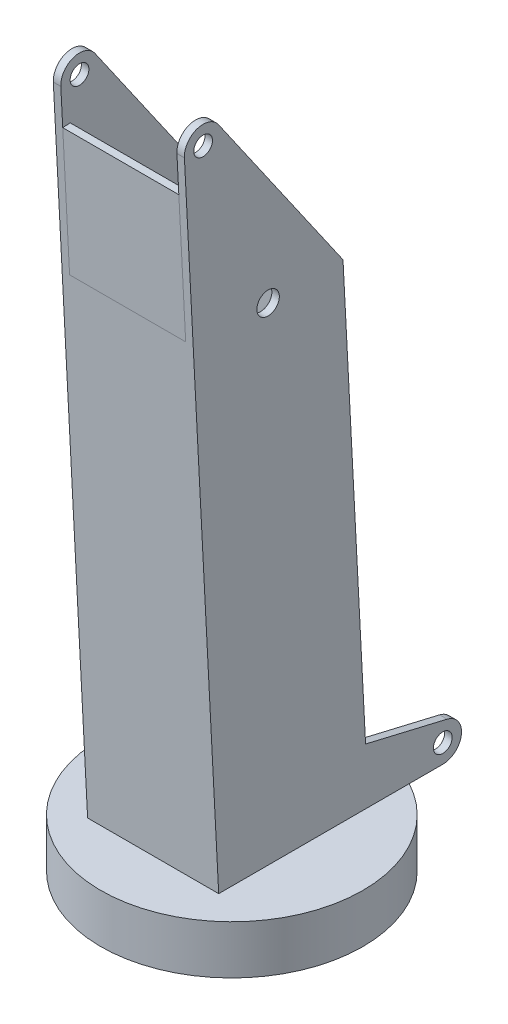
ISO-10303-21;
HEADER;
FILE_DESCRIPTION(('STEP AP214'),'2;1');
FILE_NAME('part.step','',(''),(''),'','','');
FILE_SCHEMA(('AUTOMOTIVE_DESIGN { 1 0 10303 214 1 1 1 1 }'));
ENDSEC;
DATA;
#1=APPLICATION_CONTEXT('core data for automotive mechanical design processes');
#2=APPLICATION_PROTOCOL_DEFINITION('international standard','automotive_design',2000,#1);
#3=PRODUCT_CONTEXT('',#1,'mechanical');
#4=PRODUCT('Part','Part','',(#3));
#5=PRODUCT_RELATED_PRODUCT_CATEGORY('part','',(#4));
#6=PRODUCT_DEFINITION_FORMATION('','',#4);
#7=PRODUCT_DEFINITION_CONTEXT('part definition',#1,'design');
#8=PRODUCT_DEFINITION('design','',#6,#7);
#9=PRODUCT_DEFINITION_SHAPE('','',#8);
#10=(LENGTH_UNIT() NAMED_UNIT(*) SI_UNIT(.MILLI.,.METRE.));
#11=(NAMED_UNIT(*) PLANE_ANGLE_UNIT() SI_UNIT($,.RADIAN.));
#12=(NAMED_UNIT(*) SI_UNIT($,.STERADIAN.) SOLID_ANGLE_UNIT());
#13=UNCERTAINTY_MEASURE_WITH_UNIT(LENGTH_MEASURE(1.E-05),#10,'distance_accuracy_value','');
#14=(GEOMETRIC_REPRESENTATION_CONTEXT(3) GLOBAL_UNCERTAINTY_ASSIGNED_CONTEXT((#13)) GLOBAL_UNIT_ASSIGNED_CONTEXT((#10,
#11,#12)) REPRESENTATION_CONTEXT('',''));
#15=CARTESIAN_POINT('',(0.,0.,0.));
#16=DIRECTION('',(0.,0.,1.));
#17=DIRECTION('',(1.,0.,0.));
#18=AXIS2_PLACEMENT_3D('',#15,#16,#17);
#19=CARTESIAN_POINT('',(-330.,350.56705628896,-1.6550060100623));
#20=DIRECTION('',(0.,0.998629534754574,0.0523359562429405));
#21=DIRECTION('',(0.,-0.0523359562429405,0.998629534754574));
#22=AXIS2_PLACEMENT_3D('',#19,#20,#21);
#23=PLANE('',#22);
#24=DIRECTION('',(-1.,0.,0.));
#25=VECTOR('',#24,1.);
#26=CARTESIAN_POINT('',(-330.,349.520337164101,18.3175846850292));
#27=LINE('',#26,#25);
#28=CARTESIAN_POINT('',(-20.,349.520337164101,18.3175846850292));
#29=VERTEX_POINT('',#28);
#30=CARTESIAN_POINT('',(-330.,349.520337164101,18.3175846850292));
#31=VERTEX_POINT('',#30);
#32=EDGE_CURVE('E108',#29,#31,#27,.T.);
#33=ORIENTED_EDGE('',*,*,#32,.F.);
#34=DIRECTION('',(0.,-0.0523359562429405,0.998629534754574));
#35=VECTOR('',#34,1.);
#36=CARTESIAN_POINT('',(-20.,350.56705628896,-1.6550060100623));
#37=LINE('',#36,#35);
#38=CARTESIAN_POINT('',(-20.,350.56705628896,-1.6550060100623));
#39=VERTEX_POINT('',#38);
#40=EDGE_CURVE('E12',#39,#29,#37,.T.);
#41=ORIENTED_EDGE('',*,*,#40,.F.);
#42=DIRECTION('',(-1.,0.,0.));
#43=VECTOR('',#42,1.);
#44=CARTESIAN_POINT('',(-330.,350.56705628896,-1.6550060100623));
#45=LINE('',#44,#43);
#46=CARTESIAN_POINT('',(-330.,350.56705628896,-1.6550060100623));
#47=VERTEX_POINT('',#46);
#48=EDGE_CURVE('E102',#39,#47,#45,.T.);
#49=ORIENTED_EDGE('',*,*,#48,.T.);
#50=DIRECTION('',(0.,-0.0523359562429405,0.998629534754574));
#51=VECTOR('',#50,1.);
#52=CARTESIAN_POINT('',(-330.,350.56705628896,-1.6550060100623));
#53=LINE('',#52,#51);
#54=EDGE_CURVE('E47',#47,#31,#53,.T.);
#55=ORIENTED_EDGE('',*,*,#54,.T.);
#56=EDGE_LOOP('',(#33,#41,#49,#55));
#57=FACE_BOUND('',#56,.T.);
#58=ADVANCED_FACE('F44',(#57),#23,.T.);
#59=CARTESIAN_POINT('',(-20.,350.56705628896,-1.6550060100623));
#60=DIRECTION('',(1.,0.,0.));
#61=DIRECTION('',(0.,1.,0.));
#62=AXIS2_PLACEMENT_3D('',#59,#60,#61);
#63=PLANE('',#62);
#64=DIRECTION('',(0.,0.998629534754574,0.0523359562429405));
#65=VECTOR('',#64,1.);
#66=CARTESIAN_POINT('',(-20.,349.520337164101,18.3175846850292));
#67=LINE('',#66,#65);
#68=CARTESIAN_POINT('',(-20.,0.,0.));
#69=VERTEX_POINT('',#68);
#70=EDGE_CURVE('E104',#69,#29,#67,.T.);
#71=ORIENTED_EDGE('',*,*,#70,.F.);
#72=DIRECTION('',(0.,-0.0523359562429405,0.998629534754574));
#73=VECTOR('',#72,1.);
#74=CARTESIAN_POINT('',(-20.,1.04671912485881,-19.9725906950915));
#75=LINE('',#74,#73);
#76=CARTESIAN_POINT('',(-20.,1.04671912485881,-19.9725906950915));
#77=VERTEX_POINT('',#76);
#78=EDGE_CURVE('E53',#77,#69,#75,.T.);
#79=ORIENTED_EDGE('',*,*,#78,.F.);
#80=DIRECTION('',(0.,0.998629534754574,0.0523359562429405));
#81=VECTOR('',#80,1.);
#82=CARTESIAN_POINT('',(-20.,350.56705628896,-1.6550060100623));
#83=LINE('',#82,#81);
#84=EDGE_CURVE('E99',#77,#39,#83,.T.);
#85=ORIENTED_EDGE('',*,*,#84,.T.);
#86=ORIENTED_EDGE('',*,*,#40,.T.);
#87=EDGE_LOOP('',(#71,#79,#85,#86));
#88=FACE_BOUND('',#87,.T.);
#89=ADVANCED_FACE('F118',(#88),#63,.T.);
#90=CARTESIAN_POINT('',(-330.,1.04671912485881,-19.9725906950915));
#91=DIRECTION('',(0.,-0.998629534754574,-0.0523359562429405));
#92=DIRECTION('',(0.,0.0523359562429405,-0.998629534754574));
#93=AXIS2_PLACEMENT_3D('',#90,#91,#92);
#94=PLANE('',#93);
#95=DIRECTION('',(1.,0.,0.));
#96=VECTOR('',#95,1.);
#97=CARTESIAN_POINT('',(-330.,0.,0.));
#98=LINE('',#97,#96);
#99=CARTESIAN_POINT('',(-330.,0.,0.));
#100=VERTEX_POINT('',#99);
#101=EDGE_CURVE('E94',#100,#69,#98,.T.);
#102=ORIENTED_EDGE('',*,*,#101,.F.);
#103=DIRECTION('',(0.,-0.0523359562429405,0.998629534754574));
#104=VECTOR('',#103,1.);
#105=CARTESIAN_POINT('',(-330.,1.04671912485881,-19.9725906950915));
#106=LINE('',#105,#104);
#107=CARTESIAN_POINT('',(-330.,1.04671912485881,-19.9725906950915));
#108=VERTEX_POINT('',#107);
#109=EDGE_CURVE('E89',#108,#100,#106,.T.);
#110=ORIENTED_EDGE('',*,*,#109,.F.);
#111=DIRECTION('',(1.,0.,0.));
#112=VECTOR('',#111,1.);
#113=CARTESIAN_POINT('',(-330.,1.04671912485881,-19.9725906950915));
#114=LINE('',#113,#112);
#115=EDGE_CURVE('E92',#108,#77,#114,.T.);
#116=ORIENTED_EDGE('',*,*,#115,.T.);
#117=ORIENTED_EDGE('',*,*,#78,.T.);
#118=EDGE_LOOP('',(#102,#110,#116,#117));
#119=FACE_BOUND('',#118,.T.);
#120=ADVANCED_FACE('F91',(#119),#94,.T.);
#121=CARTESIAN_POINT('',(-330.,350.56705628896,-1.6550060100623));
#122=DIRECTION('',(-1.,0.,0.));
#123=DIRECTION('',(0.,0.,1.));
#124=AXIS2_PLACEMENT_3D('',#121,#122,#123);
#125=PLANE('',#124);
#126=DIRECTION('',(0.,-0.998629534754574,-0.0523359562429405));
#127=VECTOR('',#126,1.);
#128=CARTESIAN_POINT('',(-330.,349.520337164101,18.3175846850292));
#129=LINE('',#128,#127);
#130=EDGE_CURVE('E111',#31,#100,#129,.T.);
#131=ORIENTED_EDGE('',*,*,#130,.F.);
#132=ORIENTED_EDGE('',*,*,#54,.F.);
#133=DIRECTION('',(0.,-0.998629534754574,-0.0523359562429405));
#134=VECTOR('',#133,1.);
#135=CARTESIAN_POINT('',(-330.,350.56705628896,-1.6550060100623));
#136=LINE('',#135,#134);
#137=EDGE_CURVE('E98',#47,#108,#136,.T.);
#138=ORIENTED_EDGE('',*,*,#137,.T.);
#139=ORIENTED_EDGE('',*,*,#109,.T.);
#140=EDGE_LOOP('',(#131,#132,#138,#139));
#141=FACE_BOUND('',#140,.T.);
#142=ADVANCED_FACE('F101',(#141),#125,.T.);
#143=CARTESIAN_POINT('',(0.,1.04671912485881,-19.9725906950915));
#144=DIRECTION('',(0.,0.0523359562429405,-0.998629534754574));
#145=DIRECTION('',(0.,0.998629534754574,0.0523359562429405));
#146=AXIS2_PLACEMENT_3D('',#143,#144,#145);
#147=PLANE('',#146);
#148=ORIENTED_EDGE('',*,*,#48,.F.);
#149=ORIENTED_EDGE('',*,*,#84,.F.);
#150=ORIENTED_EDGE('',*,*,#115,.F.);
#151=ORIENTED_EDGE('',*,*,#137,.F.);
#152=EDGE_LOOP('',(#148,#149,#150,#151));
#153=FACE_BOUND('',#152,.T.);
#154=ADVANCED_FACE('F97',(#153),#147,.T.);
#155=CARTESIAN_POINT('',(0.,0.,0.));
#156=DIRECTION('',(0.,0.0523359562429405,-0.998629534754574));
#157=DIRECTION('',(0.,0.998629534754574,0.0523359562429405));
#158=AXIS2_PLACEMENT_3D('',#155,#156,#157);
#159=PLANE('',#158);
#160=ORIENTED_EDGE('',*,*,#32,.T.);
#161=ORIENTED_EDGE('',*,*,#130,.T.);
#162=ORIENTED_EDGE('',*,*,#101,.T.);
#163=ORIENTED_EDGE('',*,*,#70,.T.);
#164=EDGE_LOOP('',(#160,#161,#162,#163));
#165=FACE_BOUND('',#164,.T.);
#166=ADVANCED_FACE('F117',(#165),#159,.F.);
#167=CLOSED_SHELL('',(#58,#89,#120,#142,#154,#166));
#168=MANIFOLD_SOLID_BREP('B2',#167);
#169=CARTESIAN_POINT('',(-350.,-1300.,-68.1301130679493));
#170=DIRECTION('',(0.,-1.,0.));
#171=DIRECTION('',(0.,0.,-1.));
#172=AXIS2_PLACEMENT_3D('',#169,#170,#171);
#173=PLANE('',#172);
#174=DIRECTION('',(0.,0.,-1.));
#175=VECTOR('',#174,1.);
#176=CARTESIAN_POINT('',(-330.,-1300.,-468.130113067949));
#177=LINE('',#176,#175);
#178=CARTESIAN_POINT('',(-330.,-1300.,-576.796599748962));
#179=VERTEX_POINT('',#178);
#180=CARTESIAN_POINT('',(-330.,-1300.,-666.485116622529));
#181=VERTEX_POINT('',#180);
#182=EDGE_CURVE('E521',#179,#181,#177,.T.);
#183=ORIENTED_EDGE('',*,*,#182,.F.);
#184=CARTESIAN_POINT('',(-165.,-1300.,-268.130113067949));
#185=DIRECTION('',(0.,-1.,0.));
#186=DIRECTION('',(0.,0.,-1.));
#187=AXIS2_PLACEMENT_3D('',#184,#185,#186);
#188=CIRCLE('',#187,350.);
#189=CARTESIAN_POINT('',(-350.,-1300.,-565.241203402861));
#190=VERTEX_POINT('',#189);
#191=EDGE_CURVE('E184',#190,#179,#188,.T.);
#192=ORIENTED_EDGE('',*,*,#191,.F.);
#193=DIRECTION('',(0.,0.,-1.));
#194=VECTOR('',#193,1.);
#195=CARTESIAN_POINT('',(-350.,-1300.,-68.1301130679493));
#196=LINE('',#195,#194);
#197=CARTESIAN_POINT('',(-350.,-1300.,-666.485116622529));
#198=VERTEX_POINT('',#197);
#199=EDGE_CURVE('E441',#190,#198,#196,.T.);
#200=ORIENTED_EDGE('',*,*,#199,.T.);
#201=DIRECTION('',(-1.,0.,0.));
#202=VECTOR('',#201,1.);
#203=CARTESIAN_POINT('',(-330.,-1300.,-666.485116622529));
#204=LINE('',#203,#202);
#205=EDGE_CURVE('E527',#181,#198,#204,.T.);
#206=ORIENTED_EDGE('',*,*,#205,.F.);
#207=EDGE_LOOP('',(#183,#192,#200,#206));
#208=FACE_BOUND('',#207,.T.);
#209=ADVANCED_FACE('F167',(#208),#173,.T.);
#210=CARTESIAN_POINT('',(-350.,0.,0.));
#211=DIRECTION('',(0.,1.,0.));
#212=DIRECTION('',(0.,0.,1.));
#213=AXIS2_PLACEMENT_3D('',#210,#211,#212);
#214=PLANE('',#213);
#215=DIRECTION('',(0.,0.,-1.));
#216=VECTOR('',#215,1.);
#217=CARTESIAN_POINT('',(-330.,0.,-400.));
#218=LINE('',#217,#216);
#219=CARTESIAN_POINT('',(-330.,0.,0.));
#220=VERTEX_POINT('',#219);
#221=CARTESIAN_POINT('',(-330.,0.,-20.0274469199584));
#222=VERTEX_POINT('',#221);
#223=EDGE_CURVE('E378',#220,#222,#218,.T.);
#224=ORIENTED_EDGE('',*,*,#223,.F.);
#225=DIRECTION('',(1.,0.,0.));
#226=VECTOR('',#225,1.);
#227=CARTESIAN_POINT('',(-350.,0.,0.));
#228=LINE('',#227,#226);
#229=CARTESIAN_POINT('',(-20.,0.,0.));
#230=VERTEX_POINT('',#229);
#231=EDGE_CURVE('E451',#220,#230,#228,.T.);
#232=ORIENTED_EDGE('',*,*,#231,.T.);
#233=DIRECTION('',(0.,0.,-1.));
#234=VECTOR('',#233,1.);
#235=CARTESIAN_POINT('',(-20.,0.,-400.));
#236=LINE('',#235,#234);
#237=CARTESIAN_POINT('',(-20.0000000000001,0.,-20.0274469199584));
#238=VERTEX_POINT('',#237);
#239=EDGE_CURVE('E461',#230,#238,#236,.T.);
#240=ORIENTED_EDGE('',*,*,#239,.T.);
#241=DIRECTION('',(1.,0.,0.));
#242=VECTOR('',#241,1.);
#243=CARTESIAN_POINT('',(-350.,0.,-20.0274469199584));
#244=LINE('',#243,#242);
#245=EDGE_CURVE('E419',#222,#238,#244,.T.);
#246=ORIENTED_EDGE('',*,*,#245,.F.);
#247=EDGE_LOOP('',(#224,#232,#240,#246));
#248=FACE_BOUND('',#247,.T.);
#249=ADVANCED_FACE('F551',(#248),#214,.T.);
#250=CARTESIAN_POINT('',(-20.,0.,0.));
#251=DIRECTION('',(0.,-0.0523359562429405,0.998629534754574));
#252=DIRECTION('',(0.,-0.998629534754574,-0.0523359562429405));
#253=AXIS2_PLACEMENT_3D('',#250,#251,#252);
#254=PLANE('',#253);
#255=DIRECTION('',(0.,-0.998629534754574,-0.0523359562429405));
#256=VECTOR('',#255,1.);
#257=CARTESIAN_POINT('',(0.,0.,0.));
#258=LINE('',#257,#256);
#259=CARTESIAN_POINT('',(0.,447.383202187853,23.4463601151997));
#260=VERTEX_POINT('',#259);
#261=CARTESIAN_POINT('',(0.,-1300.,-68.1301130679493));
#262=VERTEX_POINT('',#261);
#263=EDGE_CURVE('E480',#260,#262,#258,.T.);
#264=ORIENTED_EDGE('',*,*,#263,.F.);
#265=DIRECTION('',(1.,0.,0.));
#266=VECTOR('',#265,1.);
#267=CARTESIAN_POINT('',(-20.,447.383202187853,23.4463601151997));
#268=LINE('',#267,#266);
#269=CARTESIAN_POINT('',(-20.,447.383202187853,23.4463601151997));
#270=VERTEX_POINT('',#269);
#271=EDGE_CURVE('E42',#270,#260,#268,.T.);
#272=ORIENTED_EDGE('',*,*,#271,.F.);
#273=DIRECTION('',(0.,-0.998629534754574,-0.0523359562429405));
#274=VECTOR('',#273,1.);
#275=CARTESIAN_POINT('',(-20.,0.,0.));
#276=LINE('',#275,#274);
#277=EDGE_CURVE('E471',#270,#230,#276,.T.);
#278=ORIENTED_EDGE('',*,*,#277,.T.);
#279=ORIENTED_EDGE('',*,*,#231,.F.);
#280=DIRECTION('',(0.,-0.998629534754574,-0.0523359562429405));
#281=VECTOR('',#280,1.);
#282=CARTESIAN_POINT('',(-330.,0.,0.));
#283=LINE('',#282,#281);
#284=CARTESIAN_POINT('',(-330.,447.383202187853,23.4463601151997));
#285=VERTEX_POINT('',#284);
#286=EDGE_CURVE('E380',#285,#220,#283,.T.);
#287=ORIENTED_EDGE('',*,*,#286,.F.);
#288=DIRECTION('',(-1.,0.,0.));
#289=VECTOR('',#288,1.);
#290=CARTESIAN_POINT('',(-330.,447.383202187853,23.4463601151997));
#291=LINE('',#290,#289);
#292=CARTESIAN_POINT('',(-350.,447.383202187853,23.4463601151997));
#293=VERTEX_POINT('',#292);
#294=EDGE_CURVE('E387',#285,#293,#291,.T.);
#295=ORIENTED_EDGE('',*,*,#294,.T.);
#296=DIRECTION('',(0.,-0.998629534754574,-0.0523359562429405));
#297=VECTOR('',#296,1.);
#298=CARTESIAN_POINT('',(-350.,0.,0.));
#299=LINE('',#298,#297);
#300=CARTESIAN_POINT('',(-350.,-1300.,-68.1301130679493));
#301=VERTEX_POINT('',#300);
#302=EDGE_CURVE('E438',#293,#301,#299,.T.);
#303=ORIENTED_EDGE('',*,*,#302,.T.);
#304=DIRECTION('',(1.,0.,0.));
#305=VECTOR('',#304,1.);
#306=CARTESIAN_POINT('',(-350.,-1300.,-68.1301130679493));
#307=LINE('',#306,#305);
#308=EDGE_CURVE('E447',#301,#262,#307,.T.);
#309=ORIENTED_EDGE('',*,*,#308,.T.);
#310=EDGE_LOOP('',(#264,#272,#278,#279,#287,#295,#303,#309));
#311=FACE_BOUND('',#310,.T.);
#312=ADVANCED_FACE('F563',(#311),#254,.T.);
#313=CARTESIAN_POINT('',(-20.,450.,-26.485116622529));
#314=DIRECTION('',(1.,0.,0.));
#315=DIRECTION('',(0.,0.,-1.));
#316=AXIS2_PLACEMENT_3D('',#313,#314,#315);
#317=CYLINDRICAL_SURFACE('',#316,50.);
#318=CARTESIAN_POINT('',(0.,450.,-26.485116622529));
#319=DIRECTION('',(1.,0.,0.));
#320=DIRECTION('',(0.,0.,1.));
#321=AXIS2_PLACEMENT_3D('',#318,#319,#320);
#322=CIRCLE('',#321,50.);
#323=CARTESIAN_POINT('',(0.,478.527951320502,-67.5479464501853));
#324=VERTEX_POINT('',#323);
#325=EDGE_CURVE('E477',#324,#260,#322,.T.);
#326=ORIENTED_EDGE('',*,*,#325,.F.);
#327=DIRECTION('',(1.,0.,0.));
#328=VECTOR('',#327,1.);
#329=CARTESIAN_POINT('',(-20.,478.527951320502,-67.5479464501853));
#330=LINE('',#329,#328);
#331=CARTESIAN_POINT('',(-20.,478.527951320502,-67.5479464501853));
#332=VERTEX_POINT('',#331);
#333=EDGE_CURVE('E176',#332,#324,#330,.T.);
#334=ORIENTED_EDGE('',*,*,#333,.F.);
#335=CARTESIAN_POINT('',(-20.,450.,-26.485116622529));
#336=DIRECTION('',(1.,0.,0.));
#337=DIRECTION('',(0.,0.,1.));
#338=AXIS2_PLACEMENT_3D('',#335,#336,#337);
#339=CIRCLE('',#338,50.);
#340=EDGE_CURVE('E468',#332,#270,#339,.T.);
#341=ORIENTED_EDGE('',*,*,#340,.T.);
#342=ORIENTED_EDGE('',*,*,#271,.T.);
#343=EDGE_LOOP('',(#326,#334,#341,#342));
#344=FACE_BOUND('',#343,.T.);
#345=ADVANCED_FACE('F708',(#344),#317,.T.);
#346=CARTESIAN_POINT('',(-20.,478.527951320502,-67.5479464501853));
#347=DIRECTION('',(0.,0.570559026410043,-0.821256596553126));
#348=DIRECTION('',(0.,0.821256596553126,0.570559026410043));
#349=AXIS2_PLACEMENT_3D('',#346,#347,#348);
#350=PLANE('',#349);
#351=DIRECTION('',(0.,0.821256596553126,0.570559026410043));
#352=VECTOR('',#351,1.);
#353=CARTESIAN_POINT('',(0.,478.527951320502,-67.5479464501853));
#354=LINE('',#353,#352);
#355=CARTESIAN_POINT('',(0.,0.,-400.));
#356=VERTEX_POINT('',#355);
#357=EDGE_CURVE('E453',#356,#324,#354,.T.);
#358=ORIENTED_EDGE('',*,*,#357,.F.);
#359=DIRECTION('',(1.,0.,0.));
#360=VECTOR('',#359,1.);
#361=CARTESIAN_POINT('',(-20.,0.,-400.));
#362=LINE('',#361,#360);
#363=CARTESIAN_POINT('',(-20.,0.,-400.));
#364=VERTEX_POINT('',#363);
#365=EDGE_CURVE('E474',#364,#356,#362,.T.);
#366=ORIENTED_EDGE('',*,*,#365,.F.);
#367=DIRECTION('',(0.,0.821256596553126,0.570559026410043));
#368=VECTOR('',#367,1.);
#369=CARTESIAN_POINT('',(-20.,478.527951320502,-67.5479464501853));
#370=LINE('',#369,#368);
#371=EDGE_CURVE('E464',#364,#332,#370,.T.);
#372=ORIENTED_EDGE('',*,*,#371,.T.);
#373=ORIENTED_EDGE('',*,*,#333,.T.);
#374=EDGE_LOOP('',(#358,#366,#372,#373));
#375=FACE_BOUND('',#374,.T.);
#376=ADVANCED_FACE('F169',(#375),#350,.T.);
#377=CARTESIAN_POINT('',(-20.,450.,-26.485116622529));
#378=DIRECTION('',(-1.,0.,0.));
#379=DIRECTION('',(0.,0.,1.));
#380=AXIS2_PLACEMENT_3D('',#377,#378,#379);
#381=PLANE('',#380);
#382=CARTESIAN_POINT('',(-20.,0.,-200.));
#383=DIRECTION('',(-1.,0.,0.));
#384=DIRECTION('',(0.,0.,1.));
#385=AXIS2_PLACEMENT_3D('',#382,#383,#384);
#386=CIRCLE('',#385,30.);
#387=CARTESIAN_POINT('',(-20.,0.,-170.));
#388=VERTEX_POINT('',#387);
#389=EDGE_CURVE('E678',#388,#388,#386,.T.);
#390=ORIENTED_EDGE('',*,*,#389,.F.);
#391=EDGE_LOOP('',(#390));
#392=FACE_BOUND('',#391,.T.);
#393=CARTESIAN_POINT('',(-20.,450.,-26.485116622529));
#394=DIRECTION('',(-1.,0.,0.));
#395=DIRECTION('',(0.,0.,1.));
#396=AXIS2_PLACEMENT_3D('',#393,#394,#395);
#397=CIRCLE('',#396,25.);
#398=CARTESIAN_POINT('',(-20.,450.,-1.48511662252896));
#399=VERTEX_POINT('',#398);
#400=EDGE_CURVE('E400',#399,#399,#397,.F.);
#401=ORIENTED_EDGE('',*,*,#400,.T.);
#402=EDGE_LOOP('',(#401));
#403=FACE_BOUND('',#402,.T.);
#404=ORIENTED_EDGE('',*,*,#239,.F.);
#405=ORIENTED_EDGE('',*,*,#277,.F.);
#406=ORIENTED_EDGE('',*,*,#340,.F.);
#407=ORIENTED_EDGE('',*,*,#371,.F.);
#408=CARTESIAN_POINT('',(-20.,0.,-375.647075367259));
#409=VERTEX_POINT('',#408);
#410=EDGE_CURVE('E465',#409,#364,#236,.T.);
#411=ORIENTED_EDGE('',*,*,#410,.F.);
#412=DIRECTION('',(0.,0.821256596553126,0.570559026410043));
#413=VECTOR('',#412,1.);
#414=CARTESIAN_POINT('',(-20.,467.116770792301,-51.1228145191228));
#415=LINE('',#414,#413);
#416=CARTESIAN_POINT('',(-20.,-6.73402949617528,-380.325468611563));
#417=VERTEX_POINT('',#416);
#418=EDGE_CURVE('E407',#417,#409,#415,.T.);
#419=ORIENTED_EDGE('',*,*,#418,.F.);
#420=DIRECTION('',(0.,0.998629534754574,0.0523359562429405));
#421=VECTOR('',#420,1.);
#422=CARTESIAN_POINT('',(-20.,-1.0467191248588,-380.027409304909));
#423=LINE('',#422,#421);
#424=CARTESIAN_POINT('',(-20.,-1280.,-447.05451056233));
#425=VERTEX_POINT('',#424);
#426=EDGE_CURVE('E412',#425,#417,#423,.T.);
#427=ORIENTED_EDGE('',*,*,#426,.F.);
#428=DIRECTION('',(0.,0.,-1.));
#429=VECTOR('',#428,1.);
#430=CARTESIAN_POINT('',(-20.,-1280.,-68.1301130679493));
#431=LINE('',#430,#429);
#432=CARTESIAN_POINT('',(-20.,-1280.,-87.1094044022469));
#433=VERTEX_POINT('',#432);
#434=EDGE_CURVE('E403',#433,#425,#431,.T.);
#435=ORIENTED_EDGE('',*,*,#434,.F.);
#436=DIRECTION('',(0.,-0.998629534754574,-0.0523359562429405));
#437=VECTOR('',#436,1.);
#438=CARTESIAN_POINT('',(-20.,1.04671912485881,-19.9725906950915));
#439=LINE('',#438,#437);
#440=EDGE_CURVE('E404',#238,#433,#439,.T.);
#441=ORIENTED_EDGE('',*,*,#440,.F.);
#442=EDGE_LOOP('',(#404,#405,#406,#407,#411,#419,#427,#435,#441));
#443=FACE_BOUND('',#442,.T.);
#444=ADVANCED_FACE('F542',(#392,#403,#443),#381,.T.);
#445=CARTESIAN_POINT('',(0.,450.,-26.485116622529));
#446=DIRECTION('',(-1.,0.,0.));
#447=DIRECTION('',(0.,0.,1.));
#448=AXIS2_PLACEMENT_3D('',#445,#446,#447);
#449=PLANE('',#448);
#450=CARTESIAN_POINT('',(0.,0.,-200.));
#451=DIRECTION('',(1.,0.,0.));
#452=DIRECTION('',(0.,0.,-1.));
#453=AXIS2_PLACEMENT_3D('',#450,#451,#452);
#454=CIRCLE('',#453,30.);
#455=CARTESIAN_POINT('',(0.,0.,-230.));
#456=VERTEX_POINT('',#455);
#457=EDGE_CURVE('E671',#456,#456,#454,.T.);
#458=ORIENTED_EDGE('',*,*,#457,.F.);
#459=EDGE_LOOP('',(#458));
#460=FACE_BOUND('',#459,.T.);
#461=CARTESIAN_POINT('',(0.,450.,-26.485116622529));
#462=DIRECTION('',(1.,0.,0.));
#463=DIRECTION('',(0.,0.,-1.));
#464=AXIS2_PLACEMENT_3D('',#461,#462,#463);
#465=CIRCLE('',#464,25.);
#466=CARTESIAN_POINT('',(0.,450.,-51.485116622529));
#467=VERTEX_POINT('',#466);
#468=EDGE_CURVE('E395',#467,#467,#465,.T.);
#469=ORIENTED_EDGE('',*,*,#468,.F.);
#470=EDGE_LOOP('',(#469));
#471=FACE_BOUND('',#470,.T.);
#472=ORIENTED_EDGE('',*,*,#263,.T.);
#473=DIRECTION('',(0.,0.,-1.));
#474=VECTOR('',#473,1.);
#475=CARTESIAN_POINT('',(0.,-1300.,-68.1301130679493));
#476=LINE('',#475,#474);
#477=CARTESIAN_POINT('',(0.,-1300.,-576.796599748962));
#478=VERTEX_POINT('',#477);
#479=EDGE_CURVE('E448',#262,#478,#476,.T.);
#480=ORIENTED_EDGE('',*,*,#479,.T.);
#481=CARTESIAN_POINT('',(0.,-1300.,-666.485116622529));
#482=VERTEX_POINT('',#481);
#483=EDGE_CURVE('E342',#478,#482,#476,.T.);
#484=ORIENTED_EDGE('',*,*,#483,.T.);
#485=CARTESIAN_POINT('',(0.,-1250.,-666.485116622529));
#486=DIRECTION('',(1.,0.,0.));
#487=DIRECTION('',(0.,0.,1.));
#488=AXIS2_PLACEMENT_3D('',#485,#486,#487);
#489=CIRCLE('',#488,49.9999999999996);
#490=CARTESIAN_POINT('',(0.,-1201.3347852509,-677.961042442412));
#491=VERTEX_POINT('',#490);
#492=EDGE_CURVE('E360',#482,#491,#489,.T.);
#493=ORIENTED_EDGE('',*,*,#492,.T.);
#494=DIRECTION('',(0.,0.229518516397664,0.973304294982106));
#495=VECTOR('',#494,1.);
#496=CARTESIAN_POINT('',(0.,-1150.,-460.268946175494));
#497=LINE('',#496,#495);
#498=CARTESIAN_POINT('',(0.,-1150.,-460.268946175494));
#499=VERTEX_POINT('',#498);
#500=EDGE_CURVE('E351',#491,#499,#497,.T.);
#501=ORIENTED_EDGE('',*,*,#500,.T.);
#502=DIRECTION('',(0.,0.998629534754574,0.0523359562429405));
#503=VECTOR('',#502,1.);
#504=CARTESIAN_POINT('',(0.,0.,-400.));
#505=LINE('',#504,#503);
#506=EDGE_CURVE('E442',#499,#356,#505,.T.);
#507=ORIENTED_EDGE('',*,*,#506,.T.);
#508=ORIENTED_EDGE('',*,*,#357,.T.);
#509=ORIENTED_EDGE('',*,*,#325,.T.);
#510=EDGE_LOOP('',(#472,#480,#484,#493,#501,#507,#508,#509));
#511=FACE_BOUND('',#510,.T.);
#512=CARTESIAN_POINT('',(0.,-1250.,-666.485116622529));
#513=DIRECTION('',(1.,0.,0.));
#514=DIRECTION('',(0.,0.,-1.));
#515=AXIS2_PLACEMENT_3D('',#512,#513,#514);
#516=CIRCLE('',#515,25.);
#517=CARTESIAN_POINT('',(0.,-1250.,-691.485116622529));
#518=VERTEX_POINT('',#517);
#519=EDGE_CURVE('E530',#518,#518,#516,.T.);
#520=ORIENTED_EDGE('',*,*,#519,.F.);
#521=EDGE_LOOP('',(#520));
#522=FACE_BOUND('',#521,.T.);
#523=ADVANCED_FACE('F495',(#460,#471,#511,#522),#449,.F.);
#524=CARTESIAN_POINT('',(-330.,0.,-375.647075367259));
#525=VERTEX_POINT('',#524);
#526=CARTESIAN_POINT('',(-330.,0.,-400.));
#527=VERTEX_POINT('',#526);
#528=EDGE_CURVE('E381',#525,#527,#218,.T.);
#529=ORIENTED_EDGE('',*,*,#528,.F.);
#530=DIRECTION('',(-1.,0.,0.));
#531=VECTOR('',#530,1.);
#532=CARTESIAN_POINT('',(-350.,0.,-375.647075367259));
#533=LINE('',#532,#531);
#534=EDGE_CURVE('E422',#409,#525,#533,.T.);
#535=ORIENTED_EDGE('',*,*,#534,.F.);
#536=ORIENTED_EDGE('',*,*,#410,.T.);
#537=DIRECTION('',(1.,0.,0.));
#538=VECTOR('',#537,1.);
#539=CARTESIAN_POINT('',(-350.,0.,-400.));
#540=LINE('',#539,#538);
#541=EDGE_CURVE('E457',#527,#364,#540,.T.);
#542=ORIENTED_EDGE('',*,*,#541,.F.);
#543=EDGE_LOOP('',(#529,#535,#536,#542));
#544=FACE_BOUND('',#543,.T.);
#545=ADVANCED_FACE('F541',(#544),#214,.T.);
#546=CARTESIAN_POINT('',(-350.,0.,-400.));
#547=DIRECTION('',(0.,0.0523359562429405,-0.998629534754574));
#548=DIRECTION('',(0.,0.998629534754574,0.0523359562429405));
#549=AXIS2_PLACEMENT_3D('',#546,#547,#548);
#550=PLANE('',#549);
#551=DIRECTION('',(0.,-0.998629534754574,-0.0523359562429403));
#552=VECTOR('',#551,1.);
#553=CARTESIAN_POINT('',(-330.,-1150.,-460.268946175494));
#554=LINE('',#553,#552);
#555=CARTESIAN_POINT('',(-330.,-1150.,-460.268946175494));
#556=VERTEX_POINT('',#555);
#557=CARTESIAN_POINT('',(-330.,-1300.,-468.130113067949));
#558=VERTEX_POINT('',#557);
#559=EDGE_CURVE('E192',#556,#558,#554,.T.);
#560=ORIENTED_EDGE('',*,*,#559,.F.);
#561=DIRECTION('',(-1.,0.,0.));
#562=VECTOR('',#561,1.);
#563=CARTESIAN_POINT('',(-330.,-1150.,-460.268946175494));
#564=LINE('',#563,#562);
#565=CARTESIAN_POINT('',(-350.,-1150.,-460.268946175494));
#566=VERTEX_POINT('',#565);
#567=EDGE_CURVE('E523',#556,#566,#564,.T.);
#568=ORIENTED_EDGE('',*,*,#567,.T.);
#569=DIRECTION('',(0.,0.998629534754574,0.0523359562429405));
#570=VECTOR('',#569,1.);
#571=CARTESIAN_POINT('',(-350.,0.,-400.));
#572=LINE('',#571,#570);
#573=CARTESIAN_POINT('',(-350.,0.,-400.));
#574=VERTEX_POINT('',#573);
#575=EDGE_CURVE('E445',#566,#574,#572,.T.);
#576=ORIENTED_EDGE('',*,*,#575,.T.);
#577=EDGE_CURVE('E454',#574,#527,#540,.T.);
#578=ORIENTED_EDGE('',*,*,#577,.T.);
#579=ORIENTED_EDGE('',*,*,#541,.T.);
#580=ORIENTED_EDGE('',*,*,#365,.T.);
#581=ORIENTED_EDGE('',*,*,#506,.F.);
#582=DIRECTION('',(1.,0.,0.));
#583=VECTOR('',#582,1.);
#584=CARTESIAN_POINT('',(-20.,-1150.,-460.268946175494));
#585=LINE('',#584,#583);
#586=CARTESIAN_POINT('',(-20.,-1150.,-460.268946175494));
#587=VERTEX_POINT('',#586);
#588=EDGE_CURVE('E366',#587,#499,#585,.T.);
#589=ORIENTED_EDGE('',*,*,#588,.F.);
#590=DIRECTION('',(0.,-0.998629534754574,-0.0523359562429403));
#591=VECTOR('',#590,1.);
#592=CARTESIAN_POINT('',(-20.,-1150.,-460.268946175494));
#593=LINE('',#592,#591);
#594=CARTESIAN_POINT('',(-20.0000000000001,-1300.,-468.130113067949));
#595=VERTEX_POINT('',#594);
#596=EDGE_CURVE('E350',#587,#595,#593,.T.);
#597=ORIENTED_EDGE('',*,*,#596,.T.);
#598=DIRECTION('',(1.,0.,0.));
#599=VECTOR('',#598,1.);
#600=CARTESIAN_POINT('',(-350.,-1300.,-468.130113067949));
#601=LINE('',#600,#599);
#602=EDGE_CURVE('E324',#558,#595,#601,.T.);
#603=ORIENTED_EDGE('',*,*,#602,.F.);
#604=EDGE_LOOP('',(#560,#568,#576,#578,#579,#580,#581,#589,#597,#603));
#605=FACE_BOUND('',#604,.T.);
#606=ADVANCED_FACE('F486',(#605),#550,.T.);
#607=ORIENTED_EDGE('',*,*,#483,.F.);
#608=CARTESIAN_POINT('',(-20.,-1300.,-586.681521791879));
#609=VERTEX_POINT('',#608);
#610=EDGE_CURVE('E334',#609,#478,#188,.T.);
#611=ORIENTED_EDGE('',*,*,#610,.F.);
#612=DIRECTION('',(0.,0.,-1.));
#613=VECTOR('',#612,1.);
#614=CARTESIAN_POINT('',(-20.,-1300.,-468.130113067949));
#615=LINE('',#614,#613);
#616=CARTESIAN_POINT('',(-20.,-1300.,-666.485116622529));
#617=VERTEX_POINT('',#616);
#618=EDGE_CURVE('E329',#609,#617,#615,.T.);
#619=ORIENTED_EDGE('',*,*,#618,.T.);
#620=DIRECTION('',(1.,0.,0.));
#621=VECTOR('',#620,1.);
#622=CARTESIAN_POINT('',(-20.,-1300.,-666.485116622529));
#623=LINE('',#622,#621);
#624=EDGE_CURVE('E359',#617,#482,#623,.T.);
#625=ORIENTED_EDGE('',*,*,#624,.T.);
#626=EDGE_LOOP('',(#607,#611,#619,#625));
#627=FACE_BOUND('',#626,.T.);
#628=ADVANCED_FACE('F339',(#627),#173,.T.);
#629=CARTESIAN_POINT('',(-350.,0.,0.));
#630=DIRECTION('',(1.,0.,0.));
#631=DIRECTION('',(0.,0.,-1.));
#632=AXIS2_PLACEMENT_3D('',#629,#630,#631);
#633=PLANE('',#632);
#634=CARTESIAN_POINT('',(-350.,0.,-200.));
#635=DIRECTION('',(1.,0.,0.));
#636=DIRECTION('',(0.,0.,-1.));
#637=AXIS2_PLACEMENT_3D('',#634,#635,#636);
#638=CIRCLE('',#637,30.);
#639=CARTESIAN_POINT('',(-350.,0.,-230.));
#640=VERTEX_POINT('',#639);
#641=EDGE_CURVE('E673',#640,#640,#638,.T.);
#642=ORIENTED_EDGE('',*,*,#641,.T.);
#643=EDGE_LOOP('',(#642));
#644=FACE_BOUND('',#643,.T.);
#645=CARTESIAN_POINT('',(-350.,450.,-26.485116622529));
#646=DIRECTION('',(1.,0.,0.));
#647=DIRECTION('',(0.,0.,-1.));
#648=AXIS2_PLACEMENT_3D('',#645,#646,#647);
#649=CIRCLE('',#648,25.);
#650=CARTESIAN_POINT('',(-350.,450.,-51.485116622529));
#651=VERTEX_POINT('',#650);
#652=EDGE_CURVE('E368',#651,#651,#649,.T.);
#653=ORIENTED_EDGE('',*,*,#652,.T.);
#654=EDGE_LOOP('',(#653));
#655=FACE_BOUND('',#654,.T.);
#656=ORIENTED_EDGE('',*,*,#302,.F.);
#657=CARTESIAN_POINT('',(-350.,450.,-26.485116622529));
#658=DIRECTION('',(1.,0.,0.));
#659=DIRECTION('',(0.,0.,1.));
#660=AXIS2_PLACEMENT_3D('',#657,#658,#659);
#661=CIRCLE('',#660,50.);
#662=CARTESIAN_POINT('',(-350.,478.527951320502,-67.5479464501853));
#663=VERTEX_POINT('',#662);
#664=EDGE_CURVE('E377',#663,#293,#661,.T.);
#665=ORIENTED_EDGE('',*,*,#664,.F.);
#666=DIRECTION('',(0.,0.821256596553126,0.570559026410043));
#667=VECTOR('',#666,1.);
#668=CARTESIAN_POINT('',(-350.,478.527951320502,-67.5479464501853));
#669=LINE('',#668,#667);
#670=EDGE_CURVE('E390',#574,#663,#669,.T.);
#671=ORIENTED_EDGE('',*,*,#670,.F.);
#672=ORIENTED_EDGE('',*,*,#575,.F.);
#673=DIRECTION('',(0.,0.229518516397664,0.973304294982106));
#674=VECTOR('',#673,1.);
#675=CARTESIAN_POINT('',(-350.,-1150.,-460.268946175494));
#676=LINE('',#675,#674);
#677=CARTESIAN_POINT('',(-350.,-1201.3347852509,-677.961042442412));
#678=VERTEX_POINT('',#677);
#679=EDGE_CURVE('E514',#678,#566,#676,.T.);
#680=ORIENTED_EDGE('',*,*,#679,.F.);
#681=CARTESIAN_POINT('',(-350.,-1250.,-666.485116622529));
#682=DIRECTION('',(1.,0.,0.));
#683=DIRECTION('',(0.,0.,1.));
#684=AXIS2_PLACEMENT_3D('',#681,#682,#683);
#685=CIRCLE('',#684,49.9999999999996);
#686=EDGE_CURVE('E510',#198,#678,#685,.T.);
#687=ORIENTED_EDGE('',*,*,#686,.F.);
#688=ORIENTED_EDGE('',*,*,#199,.F.);
#689=EDGE_CURVE('E443',#301,#190,#196,.T.);
#690=ORIENTED_EDGE('',*,*,#689,.F.);
#691=EDGE_LOOP('',(#656,#665,#671,#672,#680,#687,#688,#690));
#692=FACE_BOUND('',#691,.T.);
#693=CARTESIAN_POINT('',(-350.,-1250.,-666.485116622529));
#694=DIRECTION('',(1.,0.,0.));
#695=DIRECTION('',(0.,0.,-1.));
#696=AXIS2_PLACEMENT_3D('',#693,#694,#695);
#697=CIRCLE('',#696,25.);
#698=CARTESIAN_POINT('',(-350.,-1250.,-691.485116622529));
#699=VERTEX_POINT('',#698);
#700=EDGE_CURVE('E517',#699,#699,#697,.T.);
#701=ORIENTED_EDGE('',*,*,#700,.T.);
#702=EDGE_LOOP('',(#701));
#703=FACE_BOUND('',#702,.T.);
#704=ADVANCED_FACE('F567',(#644,#655,#692,#703),#633,.F.);
#705=CARTESIAN_POINT('',(-20.,1.04671912485881,-19.9725906950915));
#706=DIRECTION('',(0.,-0.0523359562429405,0.998629534754574));
#707=DIRECTION('',(0.,-0.998629534754574,-0.0523359562429405));
#708=AXIS2_PLACEMENT_3D('',#705,#706,#707);
#709=PLANE('',#708);
#710=ORIENTED_EDGE('',*,*,#440,.T.);
#711=DIRECTION('',(1.,0.,0.));
#712=VECTOR('',#711,1.);
#713=CARTESIAN_POINT('',(-20.,-1280.,-87.1094044022469));
#714=LINE('',#713,#712);
#715=CARTESIAN_POINT('',(-330.,-1280.,-87.1094044022469));
#716=VERTEX_POINT('',#715);
#717=EDGE_CURVE('E413',#716,#433,#714,.T.);
#718=ORIENTED_EDGE('',*,*,#717,.F.);
#719=DIRECTION('',(0.,-0.998629534754574,-0.0523359562429405));
#720=VECTOR('',#719,1.);
#721=CARTESIAN_POINT('',(-330.,1.04671912485881,-19.9725906950915));
#722=LINE('',#721,#720);
#723=EDGE_CURVE('E408',#222,#716,#722,.T.);
#724=ORIENTED_EDGE('',*,*,#723,.F.);
#725=ORIENTED_EDGE('',*,*,#245,.T.);
#726=EDGE_LOOP('',(#710,#718,#724,#725));
#727=FACE_BOUND('',#726,.T.);
#728=ADVANCED_FACE('F572',(#727),#709,.F.);
#729=CARTESIAN_POINT('',(-20.,467.116770792301,-51.1228145191228));
#730=DIRECTION('',(0.,0.570559026410043,-0.821256596553126));
#731=DIRECTION('',(0.,0.821256596553126,0.570559026410043));
#732=AXIS2_PLACEMENT_3D('',#729,#730,#731);
#733=PLANE('',#732);
#734=ORIENTED_EDGE('',*,*,#534,.T.);
#735=DIRECTION('',(0.,0.821256596553126,0.570559026410043));
#736=VECTOR('',#735,1.);
#737=CARTESIAN_POINT('',(-330.,176.01896513667,-253.359827021747));
#738=LINE('',#737,#736);
#739=CARTESIAN_POINT('',(-330.,-6.73402949617526,-380.325468611563));
#740=VERTEX_POINT('',#739);
#741=EDGE_CURVE('E432',#740,#525,#738,.T.);
#742=ORIENTED_EDGE('',*,*,#741,.F.);
#743=DIRECTION('',(1.,0.,0.));
#744=VECTOR('',#743,1.);
#745=CARTESIAN_POINT('',(-350.,-6.73402949617526,-380.325468611563));
#746=LINE('',#745,#744);
#747=EDGE_CURVE('E406',#740,#417,#746,.T.);
#748=ORIENTED_EDGE('',*,*,#747,.T.);
#749=ORIENTED_EDGE('',*,*,#418,.T.);
#750=EDGE_LOOP('',(#734,#742,#748,#749));
#751=FACE_BOUND('',#750,.T.);
#752=ADVANCED_FACE('F590',(#751),#733,.F.);
#753=CARTESIAN_POINT('',(-350.,-1.0467191248588,-380.027409304909));
#754=DIRECTION('',(0.,0.0523359562429405,-0.998629534754574));
#755=DIRECTION('',(0.,0.998629534754574,0.0523359562429405));
#756=AXIS2_PLACEMENT_3D('',#753,#754,#755);
#757=PLANE('',#756);
#758=ORIENTED_EDGE('',*,*,#426,.T.);
#759=ORIENTED_EDGE('',*,*,#747,.F.);
#760=DIRECTION('',(0.,0.998629534754574,0.0523359562429405));
#761=VECTOR('',#760,1.);
#762=CARTESIAN_POINT('',(-330.,19.8589735286706,-378.931788378563));
#763=LINE('',#762,#761);
#764=CARTESIAN_POINT('',(-330.,-1280.,-447.05451056233));
#765=VERTEX_POINT('',#764);
#766=EDGE_CURVE('E417',#765,#740,#763,.T.);
#767=ORIENTED_EDGE('',*,*,#766,.F.);
#768=DIRECTION('',(1.,0.,0.));
#769=VECTOR('',#768,1.);
#770=CARTESIAN_POINT('',(-350.,-1280.,-447.05451056233));
#771=LINE('',#770,#769);
#772=EDGE_CURVE('E416',#765,#425,#771,.T.);
#773=ORIENTED_EDGE('',*,*,#772,.T.);
#774=EDGE_LOOP('',(#758,#759,#767,#773));
#775=FACE_BOUND('',#774,.T.);
#776=ADVANCED_FACE('F586',(#775),#757,.F.);
#777=CARTESIAN_POINT('',(-350.,-1280.,-68.1301130679493));
#778=DIRECTION('',(0.,-1.,0.));
#779=DIRECTION('',(0.,0.,-1.));
#780=AXIS2_PLACEMENT_3D('',#777,#778,#779);
#781=PLANE('',#780);
#782=ORIENTED_EDGE('',*,*,#434,.T.);
#783=ORIENTED_EDGE('',*,*,#772,.F.);
#784=DIRECTION('',(0.,0.,-1.));
#785=VECTOR('',#784,1.);
#786=CARTESIAN_POINT('',(-330.,-1280.,0.));
#787=LINE('',#786,#785);
#788=EDGE_CURVE('E411',#716,#765,#787,.T.);
#789=ORIENTED_EDGE('',*,*,#788,.F.);
#790=ORIENTED_EDGE('',*,*,#717,.T.);
#791=EDGE_LOOP('',(#782,#783,#789,#790));
#792=FACE_BOUND('',#791,.T.);
#793=ADVANCED_FACE('F582',(#792),#781,.F.);
#794=CARTESIAN_POINT('',(-330.,0.,0.));
#795=DIRECTION('',(1.,0.,0.));
#796=DIRECTION('',(0.,0.,-1.));
#797=AXIS2_PLACEMENT_3D('',#794,#795,#796);
#798=PLANE('',#797);
#799=CARTESIAN_POINT('',(-330.,0.,-200.));
#800=DIRECTION('',(1.,0.,0.));
#801=DIRECTION('',(0.,0.,-1.));
#802=AXIS2_PLACEMENT_3D('',#799,#800,#801);
#803=CIRCLE('',#802,30.);
#804=CARTESIAN_POINT('',(-330.,0.,-230.));
#805=VERTEX_POINT('',#804);
#806=EDGE_CURVE('E171',#805,#805,#803,.T.);
#807=ORIENTED_EDGE('',*,*,#806,.F.);
#808=EDGE_LOOP('',(#807));
#809=FACE_BOUND('',#808,.T.);
#810=CARTESIAN_POINT('',(-330.,450.,-26.485116622529));
#811=DIRECTION('',(1.,0.,0.));
#812=DIRECTION('',(0.,0.,-1.));
#813=AXIS2_PLACEMENT_3D('',#810,#811,#812);
#814=CIRCLE('',#813,25.);
#815=CARTESIAN_POINT('',(-330.,450.,-51.485116622529));
#816=VERTEX_POINT('',#815);
#817=EDGE_CURVE('E374',#816,#816,#814,.T.);
#818=ORIENTED_EDGE('',*,*,#817,.F.);
#819=EDGE_LOOP('',(#818));
#820=FACE_BOUND('',#819,.T.);
#821=ORIENTED_EDGE('',*,*,#723,.T.);
#822=ORIENTED_EDGE('',*,*,#788,.T.);
#823=ORIENTED_EDGE('',*,*,#766,.T.);
#824=ORIENTED_EDGE('',*,*,#741,.T.);
#825=ORIENTED_EDGE('',*,*,#528,.T.);
#826=DIRECTION('',(0.,0.821256596553126,0.570559026410043));
#827=VECTOR('',#826,1.);
#828=CARTESIAN_POINT('',(-330.,478.527951320502,-67.5479464501853));
#829=LINE('',#828,#827);
#830=CARTESIAN_POINT('',(-330.,478.527951320502,-67.5479464501853));
#831=VERTEX_POINT('',#830);
#832=EDGE_CURVE('E385',#527,#831,#829,.T.);
#833=ORIENTED_EDGE('',*,*,#832,.T.);
#834=CARTESIAN_POINT('',(-330.,450.,-26.485116622529));
#835=DIRECTION('',(1.,0.,0.));
#836=DIRECTION('',(0.,0.,1.));
#837=AXIS2_PLACEMENT_3D('',#834,#835,#836);
#838=CIRCLE('',#837,50.);
#839=EDGE_CURVE('E383',#831,#285,#838,.T.);
#840=ORIENTED_EDGE('',*,*,#839,.T.);
#841=ORIENTED_EDGE('',*,*,#286,.T.);
#842=ORIENTED_EDGE('',*,*,#223,.T.);
#843=EDGE_LOOP('',(#821,#822,#823,#824,#825,#833,#840,#841,#842));
#844=FACE_BOUND('',#843,.T.);
#845=ADVANCED_FACE('F578',(#809,#820,#844),#798,.T.);
#846=CARTESIAN_POINT('',(-90.7106781186548,450.,-26.485116622529));
#847=DIRECTION('',(1.,0.,0.));
#848=DIRECTION('',(0.,0.,-1.));
#849=AXIS2_PLACEMENT_3D('',#846,#847,#848);
#850=CYLINDRICAL_SURFACE('',#849,25.);
#851=ORIENTED_EDGE('',*,*,#468,.T.);
#852=EDGE_LOOP('',(#851));
#853=FACE_BOUND('',#852,.T.);
#854=ORIENTED_EDGE('',*,*,#400,.F.);
#855=EDGE_LOOP('',(#854));
#856=FACE_BOUND('',#855,.T.);
#857=ADVANCED_FACE('F581',(#853,#856),#850,.F.);
#858=CARTESIAN_POINT('',(-330.,478.527951320502,-67.5479464501853));
#859=DIRECTION('',(0.,-0.570559026410043,0.821256596553126));
#860=DIRECTION('',(0.,-0.821256596553126,-0.570559026410043));
#861=AXIS2_PLACEMENT_3D('',#858,#859,#860);
#862=PLANE('',#861);
#863=ORIENTED_EDGE('',*,*,#670,.T.);
#864=DIRECTION('',(-1.,0.,0.));
#865=VECTOR('',#864,1.);
#866=CARTESIAN_POINT('',(-330.,478.527951320502,-67.5479464501853));
#867=LINE('',#866,#865);
#868=EDGE_CURVE('E392',#831,#663,#867,.T.);
#869=ORIENTED_EDGE('',*,*,#868,.F.);
#870=ORIENTED_EDGE('',*,*,#832,.F.);
#871=ORIENTED_EDGE('',*,*,#577,.F.);
#872=EDGE_LOOP('',(#863,#869,#870,#871));
#873=FACE_BOUND('',#872,.T.);
#874=ADVANCED_FACE('F600',(#873),#862,.F.);
#875=CARTESIAN_POINT('',(-330.,450.,-26.485116622529));
#876=DIRECTION('',(-1.,0.,0.));
#877=DIRECTION('',(0.,0.,1.));
#878=AXIS2_PLACEMENT_3D('',#875,#876,#877);
#879=CYLINDRICAL_SURFACE('',#878,50.);
#880=ORIENTED_EDGE('',*,*,#664,.T.);
#881=ORIENTED_EDGE('',*,*,#294,.F.);
#882=ORIENTED_EDGE('',*,*,#839,.F.);
#883=ORIENTED_EDGE('',*,*,#868,.T.);
#884=EDGE_LOOP('',(#880,#881,#882,#883));
#885=FACE_BOUND('',#884,.T.);
#886=ADVANCED_FACE('F602',(#885),#879,.T.);
#887=CARTESIAN_POINT('',(50.7106781186548,450.,-26.485116622529));
#888=DIRECTION('',(-1.,0.,0.));
#889=DIRECTION('',(0.,0.,1.));
#890=AXIS2_PLACEMENT_3D('',#887,#888,#889);
#891=CYLINDRICAL_SURFACE('',#890,25.);
#892=ORIENTED_EDGE('',*,*,#652,.F.);
#893=EDGE_LOOP('',(#892));
#894=FACE_BOUND('',#893,.T.);
#895=ORIENTED_EDGE('',*,*,#817,.T.);
#896=EDGE_LOOP('',(#895));
#897=FACE_BOUND('',#896,.T.);
#898=ADVANCED_FACE('F605',(#894,#897),#891,.F.);
#899=CARTESIAN_POINT('',(-20.,-1150.,-460.268946175494));
#900=DIRECTION('',(0.,0.973304294982106,-0.229518516397664));
#901=DIRECTION('',(0.,0.229518516397664,0.973304294982106));
#902=AXIS2_PLACEMENT_3D('',#899,#900,#901);
#903=PLANE('',#902);
#904=ORIENTED_EDGE('',*,*,#500,.F.);
#905=DIRECTION('',(1.,0.,0.));
#906=VECTOR('',#905,1.);
#907=CARTESIAN_POINT('',(-20.,-1201.3347852509,-677.961042442412));
#908=LINE('',#907,#906);
#909=CARTESIAN_POINT('',(-20.,-1201.3347852509,-677.961042442412));
#910=VERTEX_POINT('',#909);
#911=EDGE_CURVE('E369',#910,#491,#908,.T.);
#912=ORIENTED_EDGE('',*,*,#911,.F.);
#913=DIRECTION('',(0.,0.229518516397664,0.973304294982106));
#914=VECTOR('',#913,1.);
#915=CARTESIAN_POINT('',(-20.,-1150.,-460.268946175494));
#916=LINE('',#915,#914);
#917=EDGE_CURVE('E356',#910,#587,#916,.T.);
#918=ORIENTED_EDGE('',*,*,#917,.T.);
#919=ORIENTED_EDGE('',*,*,#588,.T.);
#920=EDGE_LOOP('',(#904,#912,#918,#919));
#921=FACE_BOUND('',#920,.T.);
#922=ADVANCED_FACE('F501',(#921),#903,.T.);
#923=CARTESIAN_POINT('',(-20.,-1250.,-666.485116622529));
#924=DIRECTION('',(1.,0.,0.));
#925=DIRECTION('',(0.,0.,-1.));
#926=AXIS2_PLACEMENT_3D('',#923,#924,#925);
#927=CYLINDRICAL_SURFACE('',#926,49.9999999999996);
#928=ORIENTED_EDGE('',*,*,#492,.F.);
#929=ORIENTED_EDGE('',*,*,#624,.F.);
#930=CARTESIAN_POINT('',(-20.,-1250.,-666.485116622529));
#931=DIRECTION('',(1.,0.,0.));
#932=DIRECTION('',(0.,0.,1.));
#933=AXIS2_PLACEMENT_3D('',#930,#931,#932);
#934=CIRCLE('',#933,49.9999999999996);
#935=EDGE_CURVE('E328',#617,#910,#934,.T.);
#936=ORIENTED_EDGE('',*,*,#935,.T.);
#937=ORIENTED_EDGE('',*,*,#911,.T.);
#938=EDGE_LOOP('',(#928,#929,#936,#937));
#939=FACE_BOUND('',#938,.T.);
#940=ADVANCED_FACE('F613',(#939),#927,.T.);
#941=CARTESIAN_POINT('',(-20.,-1250.,-666.485116622529));
#942=DIRECTION('',(-1.,0.,0.));
#943=DIRECTION('',(0.,0.,1.));
#944=AXIS2_PLACEMENT_3D('',#941,#942,#943);
#945=PLANE('',#944);
#946=CARTESIAN_POINT('',(-20.,-1250.,-666.485116622529));
#947=DIRECTION('',(1.,0.,0.));
#948=DIRECTION('',(0.,0.,-1.));
#949=AXIS2_PLACEMENT_3D('',#946,#947,#948);
#950=CIRCLE('',#949,25.);
#951=CARTESIAN_POINT('',(-20.,-1250.,-691.485116622529));
#952=VERTEX_POINT('',#951);
#953=EDGE_CURVE('E363',#952,#952,#950,.T.);
#954=ORIENTED_EDGE('',*,*,#953,.T.);
#955=EDGE_LOOP('',(#954));
#956=FACE_BOUND('',#955,.T.);
#957=ORIENTED_EDGE('',*,*,#596,.F.);
#958=ORIENTED_EDGE('',*,*,#917,.F.);
#959=ORIENTED_EDGE('',*,*,#935,.F.);
#960=ORIENTED_EDGE('',*,*,#618,.F.);
#961=EDGE_CURVE('E320',#595,#609,#615,.T.);
#962=ORIENTED_EDGE('',*,*,#961,.F.);
#963=EDGE_LOOP('',(#957,#958,#959,#960,#962));
#964=FACE_BOUND('',#963,.T.);
#965=ADVANCED_FACE('F347',(#956,#964),#945,.T.);
#966=CARTESIAN_POINT('',(-20.,-1250.,-666.485116622529));
#967=DIRECTION('',(1.,0.,0.));
#968=DIRECTION('',(0.,0.,-1.));
#969=AXIS2_PLACEMENT_3D('',#966,#967,#968);
#970=CYLINDRICAL_SURFACE('',#969,25.);
#971=ORIENTED_EDGE('',*,*,#953,.F.);
#972=EDGE_LOOP('',(#971));
#973=FACE_BOUND('',#972,.T.);
#974=ORIENTED_EDGE('',*,*,#519,.T.);
#975=EDGE_LOOP('',(#974));
#976=FACE_BOUND('',#975,.T.);
#977=ADVANCED_FACE('F539',(#973,#976),#970,.F.);
#978=CARTESIAN_POINT('',(-330.,-1250.,-666.485116622529));
#979=DIRECTION('',(1.,0.,0.));
#980=DIRECTION('',(0.,0.,1.));
#981=AXIS2_PLACEMENT_3D('',#978,#979,#980);
#982=PLANE('',#981);
#983=ORIENTED_EDGE('',*,*,#559,.T.);
#984=EDGE_CURVE('E506',#558,#179,#177,.T.);
#985=ORIENTED_EDGE('',*,*,#984,.T.);
#986=ORIENTED_EDGE('',*,*,#182,.T.);
#987=CARTESIAN_POINT('',(-330.,-1250.,-666.485116622529));
#988=DIRECTION('',(1.,0.,0.));
#989=DIRECTION('',(0.,0.,1.));
#990=AXIS2_PLACEMENT_3D('',#987,#988,#989);
#991=CIRCLE('',#990,49.9999999999996);
#992=CARTESIAN_POINT('',(-330.,-1201.3347852509,-677.961042442412));
#993=VERTEX_POINT('',#992);
#994=EDGE_CURVE('E512',#181,#993,#991,.T.);
#995=ORIENTED_EDGE('',*,*,#994,.T.);
#996=DIRECTION('',(0.,0.229518516397664,0.973304294982106));
#997=VECTOR('',#996,1.);
#998=CARTESIAN_POINT('',(-330.,-1150.,-460.268946175494));
#999=LINE('',#998,#997);
#1000=EDGE_CURVE('E508',#993,#556,#999,.T.);
#1001=ORIENTED_EDGE('',*,*,#1000,.T.);
#1002=EDGE_LOOP('',(#983,#985,#986,#995,#1001));
#1003=FACE_BOUND('',#1002,.T.);
#1004=CARTESIAN_POINT('',(-330.,-1250.,-666.485116622529));
#1005=DIRECTION('',(1.,0.,0.));
#1006=DIRECTION('',(0.,0.,-1.));
#1007=AXIS2_PLACEMENT_3D('',#1004,#1005,#1006);
#1008=CIRCLE('',#1007,25.);
#1009=CARTESIAN_POINT('',(-330.,-1250.,-691.485116622529));
#1010=VERTEX_POINT('',#1009);
#1011=EDGE_CURVE('E525',#1010,#1010,#1008,.T.);
#1012=ORIENTED_EDGE('',*,*,#1011,.F.);
#1013=EDGE_LOOP('',(#1012));
#1014=FACE_BOUND('',#1013,.T.);
#1015=ADVANCED_FACE('F504',(#1003,#1014),#982,.T.);
#1016=CARTESIAN_POINT('',(-330.,-1250.,-666.485116622529));
#1017=DIRECTION('',(-1.,0.,0.));
#1018=DIRECTION('',(0.,0.,1.));
#1019=AXIS2_PLACEMENT_3D('',#1016,#1017,#1018);
#1020=CYLINDRICAL_SURFACE('',#1019,49.9999999999996);
#1021=ORIENTED_EDGE('',*,*,#686,.T.);
#1022=DIRECTION('',(-1.,0.,0.));
#1023=VECTOR('',#1022,1.);
#1024=CARTESIAN_POINT('',(-330.,-1201.3347852509,-677.961042442412));
#1025=LINE('',#1024,#1023);
#1026=EDGE_CURVE('E531',#993,#678,#1025,.T.);
#1027=ORIENTED_EDGE('',*,*,#1026,.F.);
#1028=ORIENTED_EDGE('',*,*,#994,.F.);
#1029=ORIENTED_EDGE('',*,*,#205,.T.);
#1030=EDGE_LOOP('',(#1021,#1027,#1028,#1029));
#1031=FACE_BOUND('',#1030,.T.);
#1032=ADVANCED_FACE('F629',(#1031),#1020,.T.);
#1033=CARTESIAN_POINT('',(-330.,-1150.,-460.268946175494));
#1034=DIRECTION('',(0.,-0.973304294982106,0.229518516397664));
#1035=DIRECTION('',(0.,-0.229518516397664,-0.973304294982106));
#1036=AXIS2_PLACEMENT_3D('',#1033,#1034,#1035);
#1037=PLANE('',#1036);
#1038=ORIENTED_EDGE('',*,*,#679,.T.);
#1039=ORIENTED_EDGE('',*,*,#567,.F.);
#1040=ORIENTED_EDGE('',*,*,#1000,.F.);
#1041=ORIENTED_EDGE('',*,*,#1026,.T.);
#1042=EDGE_LOOP('',(#1038,#1039,#1040,#1041));
#1043=FACE_BOUND('',#1042,.T.);
#1044=ADVANCED_FACE('F625',(#1043),#1037,.F.);
#1045=CARTESIAN_POINT('',(-330.,-1250.,-666.485116622529));
#1046=DIRECTION('',(-1.,0.,0.));
#1047=DIRECTION('',(0.,0.,1.));
#1048=AXIS2_PLACEMENT_3D('',#1045,#1046,#1047);
#1049=CYLINDRICAL_SURFACE('',#1048,25.);
#1050=ORIENTED_EDGE('',*,*,#1011,.T.);
#1051=EDGE_LOOP('',(#1050));
#1052=FACE_BOUND('',#1051,.T.);
#1053=ORIENTED_EDGE('',*,*,#700,.F.);
#1054=EDGE_LOOP('',(#1053));
#1055=FACE_BOUND('',#1054,.T.);
#1056=ADVANCED_FACE('F628',(#1052,#1055),#1049,.F.);
#1057=CARTESIAN_POINT('',(-350.,0.,-200.));
#1058=DIRECTION('',(1.,0.,0.));
#1059=DIRECTION('',(0.,0.,-1.));
#1060=AXIS2_PLACEMENT_3D('',#1057,#1058,#1059);
#1061=CYLINDRICAL_SURFACE('',#1060,30.);
#1062=ORIENTED_EDGE('',*,*,#806,.T.);
#1063=EDGE_LOOP('',(#1062));
#1064=FACE_BOUND('',#1063,.T.);
#1065=ORIENTED_EDGE('',*,*,#641,.F.);
#1066=EDGE_LOOP('',(#1065));
#1067=FACE_BOUND('',#1066,.T.);
#1068=ADVANCED_FACE('F638',(#1064,#1067),#1061,.F.);
#1069=ORIENTED_EDGE('',*,*,#389,.T.);
#1070=EDGE_LOOP('',(#1069));
#1071=FACE_BOUND('',#1070,.T.);
#1072=ORIENTED_EDGE('',*,*,#457,.T.);
#1073=EDGE_LOOP('',(#1072));
#1074=FACE_BOUND('',#1073,.T.);
#1075=ADVANCED_FACE('F642',(#1071,#1074),#1061,.F.);
#1076=CARTESIAN_POINT('',(-165.,-1300.,-268.130113067949));
#1077=DIRECTION('',(0.,-1.,0.));
#1078=DIRECTION('',(0.,0.,-1.));
#1079=AXIS2_PLACEMENT_3D('',#1076,#1077,#1078);
#1080=PLANE('',#1079);
#1081=EDGE_CURVE('E345',#478,#190,#188,.T.);
#1082=ORIENTED_EDGE('',*,*,#1081,.F.);
#1083=ORIENTED_EDGE('',*,*,#479,.F.);
#1084=ORIENTED_EDGE('',*,*,#308,.F.);
#1085=ORIENTED_EDGE('',*,*,#689,.T.);
#1086=EDGE_LOOP('',(#1082,#1083,#1084,#1085));
#1087=FACE_BOUND('',#1086,.T.);
#1088=ADVANCED_FACE('F647',(#1087),#1080,.F.);
#1089=CARTESIAN_POINT('',(-165.,-1430.,-268.130113067949));
#1090=DIRECTION('',(0.,1.,0.));
#1091=DIRECTION('',(0.,0.,1.));
#1092=AXIS2_PLACEMENT_3D('',#1089,#1090,#1091);
#1093=CYLINDRICAL_SURFACE('',#1092,350.);
#1094=CARTESIAN_POINT('',(-165.,-1430.,-268.130113067949));
#1095=DIRECTION('',(0.,-1.,0.));
#1096=DIRECTION('',(0.,0.,-1.));
#1097=AXIS2_PLACEMENT_3D('',#1094,#1095,#1096);
#1098=CIRCLE('',#1097,350.);
#1099=CARTESIAN_POINT('',(-165.,-1430.,-618.130113067949));
#1100=VERTEX_POINT('',#1099);
#1101=EDGE_CURVE('E344',#1100,#1100,#1098,.T.);
#1102=ORIENTED_EDGE('',*,*,#1101,.F.);
#1103=EDGE_LOOP('',(#1102));
#1104=FACE_BOUND('',#1103,.T.);
#1105=ORIENTED_EDGE('',*,*,#610,.T.);
#1106=ORIENTED_EDGE('',*,*,#1081,.T.);
#1107=ORIENTED_EDGE('',*,*,#191,.T.);
#1108=EDGE_CURVE('E322',#179,#609,#188,.T.);
#1109=ORIENTED_EDGE('',*,*,#1108,.T.);
#1110=EDGE_LOOP('',(#1105,#1106,#1107,#1109));
#1111=FACE_BOUND('',#1110,.T.);
#1112=ADVANCED_FACE('F333',(#1104,#1111),#1093,.T.);
#1113=CARTESIAN_POINT('',(-165.,-1430.,-268.130113067949));
#1114=DIRECTION('',(0.,-1.,0.));
#1115=DIRECTION('',(0.,0.,-1.));
#1116=AXIS2_PLACEMENT_3D('',#1113,#1114,#1115);
#1117=PLANE('',#1116);
#1118=CARTESIAN_POINT('',(-165.,-1430.,-268.130113067949));
#1119=DIRECTION('',(0.,-1.,0.));
#1120=DIRECTION('',(0.,0.,-1.));
#1121=AXIS2_PLACEMENT_3D('',#1118,#1119,#1120);
#1122=CIRCLE('',#1121,300.);
#1123=CARTESIAN_POINT('',(-165.,-1430.,-568.130113067949));
#1124=VERTEX_POINT('',#1123);
#1125=EDGE_CURVE('E665',#1124,#1124,#1122,.T.);
#1126=ORIENTED_EDGE('',*,*,#1125,.F.);
#1127=EDGE_LOOP('',(#1126));
#1128=FACE_BOUND('',#1127,.T.);
#1129=ORIENTED_EDGE('',*,*,#1101,.T.);
#1130=EDGE_LOOP('',(#1129));
#1131=FACE_BOUND('',#1130,.T.);
#1132=ADVANCED_FACE('F646',(#1128,#1131),#1117,.T.);
#1133=ORIENTED_EDGE('',*,*,#961,.T.);
#1134=ORIENTED_EDGE('',*,*,#1108,.F.);
#1135=ORIENTED_EDGE('',*,*,#984,.F.);
#1136=ORIENTED_EDGE('',*,*,#602,.T.);
#1137=EDGE_LOOP('',(#1133,#1134,#1135,#1136));
#1138=FACE_BOUND('',#1137,.T.);
#1139=ADVANCED_FACE('F321',(#1138),#1080,.F.);
#1140=CARTESIAN_POINT('',(-165.,-1330.,-268.130113067949));
#1141=DIRECTION('',(0.,-1.,0.));
#1142=DIRECTION('',(0.,0.,-1.));
#1143=AXIS2_PLACEMENT_3D('',#1140,#1141,#1142);
#1144=CYLINDRICAL_SURFACE('',#1143,300.);
#1145=CARTESIAN_POINT('',(-165.,-1330.,-268.130113067949));
#1146=DIRECTION('',(0.,-1.,0.));
#1147=DIRECTION('',(0.,0.,-1.));
#1148=AXIS2_PLACEMENT_3D('',#1145,#1146,#1147);
#1149=CIRCLE('',#1148,300.);
#1150=CARTESIAN_POINT('',(-165.,-1330.,-568.130113067949));
#1151=VERTEX_POINT('',#1150);
#1152=EDGE_CURVE('E336',#1151,#1151,#1149,.T.);
#1153=ORIENTED_EDGE('',*,*,#1152,.F.);
#1154=EDGE_LOOP('',(#1153));
#1155=FACE_BOUND('',#1154,.T.);
#1156=ORIENTED_EDGE('',*,*,#1125,.T.);
#1157=EDGE_LOOP('',(#1156));
#1158=FACE_BOUND('',#1157,.T.);
#1159=ADVANCED_FACE('F651',(#1155,#1158),#1144,.F.);
#1160=CARTESIAN_POINT('',(-165.,-1330.,-268.130113067949));
#1161=DIRECTION('',(0.,-1.,0.));
#1162=DIRECTION('',(0.,0.,-1.));
#1163=AXIS2_PLACEMENT_3D('',#1160,#1161,#1162);
#1164=PLANE('',#1163);
#1165=ORIENTED_EDGE('',*,*,#1152,.T.);
#1166=EDGE_LOOP('',(#1165));
#1167=FACE_BOUND('',#1166,.T.);
#1168=ADVANCED_FACE('F657',(#1167),#1164,.T.);
#1169=CLOSED_SHELL('',(#209,#249,#312,#345,#376,#444,#523,#545,#606,#628,#704,#728,#752,#776,
#793,#845,#857,#874,#886,#898,#922,#940,#965,#977,#1015,#1032,#1044,#1056,#1068,#1075,#1088,
#1112,#1132,#1139,#1159,#1168));
#1170=MANIFOLD_SOLID_BREP('B6',#1169);
#1171=ADVANCED_BREP_SHAPE_REPRESENTATION('',(#18,#168,#1170),#14);
#1172=SHAPE_DEFINITION_REPRESENTATION(#9,#1171);
ENDSEC;
END-ISO-10303-21;
